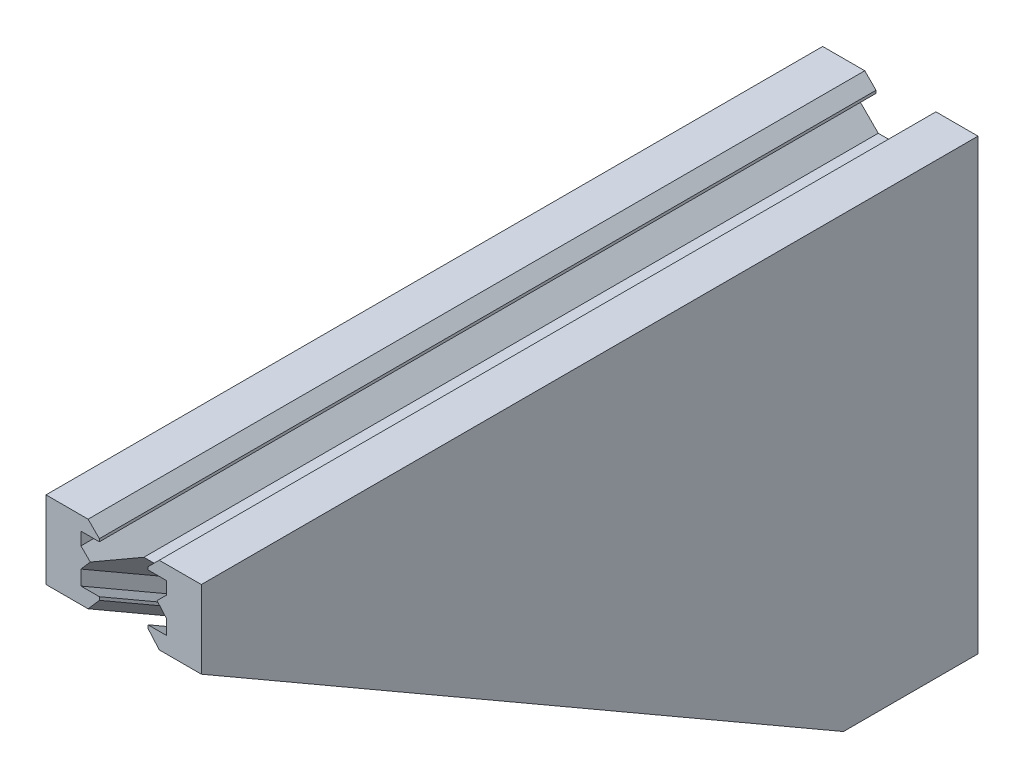
ISO-10303-21;
HEADER;
FILE_DESCRIPTION(('STEP AP214'),'2;1');
FILE_NAME('part.step','',(''),(''),'','','');
FILE_SCHEMA(('AUTOMOTIVE_DESIGN { 1 0 10303 214 1 1 1 1 }'));
ENDSEC;
DATA;
#1=APPLICATION_CONTEXT('core data for automotive mechanical design processes');
#2=APPLICATION_PROTOCOL_DEFINITION('international standard','automotive_design',2000,#1);
#3=PRODUCT_CONTEXT('',#1,'mechanical');
#4=PRODUCT('Part','Part','',(#3));
#5=PRODUCT_RELATED_PRODUCT_CATEGORY('part','',(#4));
#6=PRODUCT_DEFINITION_FORMATION('','',#4);
#7=PRODUCT_DEFINITION_CONTEXT('part definition',#1,'design');
#8=PRODUCT_DEFINITION('design','',#6,#7);
#9=PRODUCT_DEFINITION_SHAPE('','',#8);
#10=(LENGTH_UNIT() NAMED_UNIT(*) SI_UNIT(.MILLI.,.METRE.));
#11=(NAMED_UNIT(*) PLANE_ANGLE_UNIT() SI_UNIT($,.RADIAN.));
#12=(NAMED_UNIT(*) SI_UNIT($,.STERADIAN.) SOLID_ANGLE_UNIT());
#13=UNCERTAINTY_MEASURE_WITH_UNIT(LENGTH_MEASURE(1.E-05),#10,'distance_accuracy_value','');
#14=(GEOMETRIC_REPRESENTATION_CONTEXT(3) GLOBAL_UNCERTAINTY_ASSIGNED_CONTEXT((#13)) GLOBAL_UNIT_ASSIGNED_CONTEXT((#10,
#11,#12)) REPRESENTATION_CONTEXT('',''));
#15=CARTESIAN_POINT('',(0.,0.,0.));
#16=DIRECTION('',(0.,0.,1.));
#17=DIRECTION('',(1.,0.,0.));
#18=AXIS2_PLACEMENT_3D('',#15,#16,#17);
#19=CARTESIAN_POINT('',(10.,-10.,100.));
#20=DIRECTION('',(0.,0.,-1.));
#21=DIRECTION('',(-1.,0.,0.));
#22=AXIS2_PLACEMENT_3D('',#19,#20,#21);
#23=PLANE('',#22);
#24=DIRECTION('',(-0.654653670707976,0.755928946018456,0.));
#25=VECTOR('',#24,1.);
#26=CARTESIAN_POINT('',(6.90285714285712,-12.6822043934353,100.));
#27=LINE('',#26,#25);
#28=CARTESIAN_POINT('',(4.58,-10.0000000000001,100.));
#29=VERTEX_POINT('',#28);
#30=CARTESIAN_POINT('',(3.13,-8.32568421935014,100.));
#31=VERTEX_POINT('',#30);
#32=EDGE_CURVE('E309',#29,#31,#27,.T.);
#33=ORIENTED_EDGE('',*,*,#32,.F.);
#34=DIRECTION('',(-1.,0.,0.));
#35=VECTOR('',#34,1.);
#36=CARTESIAN_POINT('',(10.,-10.,100.));
#37=LINE('',#36,#35);
#38=CARTESIAN_POINT('',(10.,-10.,100.));
#39=VERTEX_POINT('',#38);
#40=EDGE_CURVE('E249',#39,#29,#37,.T.);
#41=ORIENTED_EDGE('',*,*,#40,.F.);
#42=DIRECTION('',(0.,-1.,0.));
#43=VECTOR('',#42,1.);
#44=CARTESIAN_POINT('',(10.,-10.,100.));
#45=LINE('',#44,#43);
#46=CARTESIAN_POINT('',(10.,0.,100.));
#47=VERTEX_POINT('',#46);
#48=EDGE_CURVE('E403',#47,#39,#45,.T.);
#49=ORIENTED_EDGE('',*,*,#48,.F.);
#50=DIRECTION('',(-1.,0.,0.));
#51=VECTOR('',#50,1.);
#52=CARTESIAN_POINT('',(10.,0.,100.));
#53=LINE('',#52,#51);
#54=CARTESIAN_POINT('',(4.58,0.,100.));
#55=VERTEX_POINT('',#54);
#56=EDGE_CURVE('E419',#47,#55,#53,.T.);
#57=ORIENTED_EDGE('',*,*,#56,.T.);
#58=DIRECTION('',(0.707106781186547,0.707106781186548,0.));
#59=VECTOR('',#58,1.);
#60=CARTESIAN_POINT('',(4.58,0.,100.));
#61=LINE('',#60,#59);
#62=CARTESIAN_POINT('',(3.13,-1.45000000000001,100.));
#63=VERTEX_POINT('',#62);
#64=EDGE_CURVE('E317',#63,#55,#61,.T.);
#65=ORIENTED_EDGE('',*,*,#64,.F.);
#66=DIRECTION('',(0.,1.,0.));
#67=VECTOR('',#66,1.);
#68=CARTESIAN_POINT('',(3.13,-1.45000000000001,100.));
#69=LINE('',#68,#67);
#70=CARTESIAN_POINT('',(3.13,-1.8,100.));
#71=VERTEX_POINT('',#70);
#72=EDGE_CURVE('E366',#71,#63,#69,.T.);
#73=ORIENTED_EDGE('',*,*,#72,.F.);
#74=DIRECTION('',(-1.,0.,0.));
#75=VECTOR('',#74,1.);
#76=CARTESIAN_POINT('',(3.13,-1.8,100.));
#77=LINE('',#76,#75);
#78=CARTESIAN_POINT('',(5.5,-1.8,100.));
#79=VERTEX_POINT('',#78);
#80=EDGE_CURVE('E363',#79,#71,#77,.T.);
#81=ORIENTED_EDGE('',*,*,#80,.F.);
#82=DIRECTION('',(0.,1.,0.));
#83=VECTOR('',#82,1.);
#84=CARTESIAN_POINT('',(5.5,-1.8,100.));
#85=LINE('',#84,#83);
#86=CARTESIAN_POINT('',(5.5,-3.44,100.));
#87=VERTEX_POINT('',#86);
#88=EDGE_CURVE('E360',#87,#79,#85,.T.);
#89=ORIENTED_EDGE('',*,*,#88,.F.);
#90=DIRECTION('',(0.707106781186546,0.707106781186549,0.));
#91=VECTOR('',#90,1.);
#92=CARTESIAN_POINT('',(5.5,-3.44,100.));
#93=LINE('',#92,#91);
#94=CARTESIAN_POINT('',(4.29898384862244,-4.64101615137756,100.));
#95=VERTEX_POINT('',#94);
#96=EDGE_CURVE('E300',#95,#87,#93,.T.);
#97=ORIENTED_EDGE('',*,*,#96,.F.);
#98=DIRECTION('',(-0.654653670707975,0.755928946018457,0.));
#99=VECTOR('',#98,1.);
#100=CARTESIAN_POINT('',(9.3942857142857,-10.5245639588638,100.));
#101=LINE('',#100,#99);
#102=CARTESIAN_POINT('',(5.5,-6.02783014797542,100.));
#103=VERTEX_POINT('',#102);
#104=EDGE_CURVE('E298',#103,#95,#101,.T.);
#105=ORIENTED_EDGE('',*,*,#104,.F.);
#106=DIRECTION('',(0.,1.,0.));
#107=VECTOR('',#106,1.);
#108=CARTESIAN_POINT('',(5.5,-10.,100.));
#109=LINE('',#108,#107);
#110=CARTESIAN_POINT('',(5.5,-7.9215390309174,100.));
#111=VERTEX_POINT('',#110);
#112=EDGE_CURVE('E275',#111,#103,#109,.T.);
#113=ORIENTED_EDGE('',*,*,#112,.F.);
#114=DIRECTION('',(1.,0.,0.));
#115=VECTOR('',#114,1.);
#116=CARTESIAN_POINT('',(10.,-7.9215390309174,100.));
#117=LINE('',#116,#115);
#118=CARTESIAN_POINT('',(3.13,-7.9215390309174,100.));
#119=VERTEX_POINT('',#118);
#120=EDGE_CURVE('E44',#119,#111,#117,.T.);
#121=ORIENTED_EDGE('',*,*,#120,.F.);
#122=DIRECTION('',(0.,1.,0.));
#123=VECTOR('',#122,1.);
#124=CARTESIAN_POINT('',(3.13,-10.,100.));
#125=LINE('',#124,#123);
#126=EDGE_CURVE('E11',#31,#119,#125,.T.);
#127=ORIENTED_EDGE('',*,*,#126,.F.);
#128=EDGE_LOOP('',(#33,#41,#49,#57,#65,#73,#81,#89,#97,#105,#113,#121,#127));
#129=FACE_BOUND('',#128,.T.);
#130=ADVANCED_FACE('F35',(#129),#23,.F.);
#131=DIRECTION('',(-0.654653670707974,-0.755928946018457,0.));
#132=VECTOR('',#131,1.);
#133=CARTESIAN_POINT('',(-0.822857142857193,-0.627130772755913,100.));
#134=LINE('',#133,#132);
#135=CARTESIAN_POINT('',(-4.29898384862244,-4.64101615137756,100.));
#136=VERTEX_POINT('',#135);
#137=CARTESIAN_POINT('',(-5.49999999999999,-6.02783014797542,100.));
#138=VERTEX_POINT('',#137);
#139=EDGE_CURVE('E304',#136,#138,#134,.T.);
#140=ORIENTED_EDGE('',*,*,#139,.F.);
#141=DIRECTION('',(0.707106781186546,-0.707106781186549,0.));
#142=VECTOR('',#141,1.);
#143=CARTESIAN_POINT('',(-5.5,-3.44,100.));
#144=LINE('',#143,#142);
#145=CARTESIAN_POINT('',(-5.5,-3.44,100.));
#146=VERTEX_POINT('',#145);
#147=EDGE_CURVE('E356',#146,#136,#144,.T.);
#148=ORIENTED_EDGE('',*,*,#147,.F.);
#149=DIRECTION('',(0.,-1.,0.));
#150=VECTOR('',#149,1.);
#151=CARTESIAN_POINT('',(-5.5,-1.8,100.));
#152=LINE('',#151,#150);
#153=CARTESIAN_POINT('',(-5.5,-1.8,100.));
#154=VERTEX_POINT('',#153);
#155=EDGE_CURVE('E353',#154,#146,#152,.T.);
#156=ORIENTED_EDGE('',*,*,#155,.F.);
#157=DIRECTION('',(-1.,0.,0.));
#158=VECTOR('',#157,1.);
#159=CARTESIAN_POINT('',(-3.13,-1.8,100.));
#160=LINE('',#159,#158);
#161=CARTESIAN_POINT('',(-3.13,-1.8,100.));
#162=VERTEX_POINT('',#161);
#163=EDGE_CURVE('E350',#162,#154,#160,.T.);
#164=ORIENTED_EDGE('',*,*,#163,.F.);
#165=DIRECTION('',(0.,-1.,0.));
#166=VECTOR('',#165,1.);
#167=CARTESIAN_POINT('',(-3.13,-1.45000000000001,100.));
#168=LINE('',#167,#166);
#169=CARTESIAN_POINT('',(-3.13,-1.45000000000001,100.));
#170=VERTEX_POINT('',#169);
#171=EDGE_CURVE('E307',#170,#162,#168,.T.);
#172=ORIENTED_EDGE('',*,*,#171,.F.);
#173=DIRECTION('',(0.707106781186546,-0.707106781186548,0.));
#174=VECTOR('',#173,1.);
#175=CARTESIAN_POINT('',(-4.58,0.,100.));
#176=LINE('',#175,#174);
#177=CARTESIAN_POINT('',(-4.57999999999997,0.,100.));
#178=VERTEX_POINT('',#177);
#179=EDGE_CURVE('E303',#178,#170,#176,.T.);
#180=ORIENTED_EDGE('',*,*,#179,.F.);
#181=CARTESIAN_POINT('',(-10.,0.,100.));
#182=VERTEX_POINT('',#181);
#183=EDGE_CURVE('E418',#178,#182,#53,.T.);
#184=ORIENTED_EDGE('',*,*,#183,.T.);
#185=DIRECTION('',(0.,-1.,0.));
#186=VECTOR('',#185,1.);
#187=CARTESIAN_POINT('',(-10.,-10.,100.));
#188=LINE('',#187,#186);
#189=CARTESIAN_POINT('',(-10.,-10.,100.));
#190=VERTEX_POINT('',#189);
#191=EDGE_CURVE('E412',#182,#190,#188,.T.);
#192=ORIENTED_EDGE('',*,*,#191,.T.);
#193=CARTESIAN_POINT('',(-4.58,-10.0000000000001,100.));
#194=VERTEX_POINT('',#193);
#195=EDGE_CURVE('E407',#194,#190,#37,.T.);
#196=ORIENTED_EDGE('',*,*,#195,.F.);
#197=DIRECTION('',(-0.654653670707976,-0.755928946018456,0.));
#198=VECTOR('',#197,1.);
#199=CARTESIAN_POINT('',(1.66857142857141,-2.78477120732741,100.));
#200=LINE('',#199,#198);
#201=CARTESIAN_POINT('',(-3.13,-8.32568421935014,100.));
#202=VERTEX_POINT('',#201);
#203=EDGE_CURVE('E250',#202,#194,#200,.T.);
#204=ORIENTED_EDGE('',*,*,#203,.F.);
#205=DIRECTION('',(0.,-1.,0.));
#206=VECTOR('',#205,1.);
#207=CARTESIAN_POINT('',(-3.13,-10.,100.));
#208=LINE('',#207,#206);
#209=CARTESIAN_POINT('',(-3.13,-7.9215390309174,100.));
#210=VERTEX_POINT('',#209);
#211=EDGE_CURVE('E269',#210,#202,#208,.T.);
#212=ORIENTED_EDGE('',*,*,#211,.F.);
#213=DIRECTION('',(1.,0.,0.));
#214=VECTOR('',#213,1.);
#215=CARTESIAN_POINT('',(10.,-7.9215390309174,100.));
#216=LINE('',#215,#214);
#217=CARTESIAN_POINT('',(-5.49999999999999,-7.9215390309174,100.));
#218=VERTEX_POINT('',#217);
#219=EDGE_CURVE('E271',#218,#210,#216,.T.);
#220=ORIENTED_EDGE('',*,*,#219,.F.);
#221=DIRECTION('',(0.,-1.,0.));
#222=VECTOR('',#221,1.);
#223=CARTESIAN_POINT('',(-5.49999999999999,-10.,100.));
#224=LINE('',#223,#222);
#225=EDGE_CURVE('E273',#138,#218,#224,.T.);
#226=ORIENTED_EDGE('',*,*,#225,.F.);
#227=EDGE_LOOP('',(#140,#148,#156,#164,#172,#180,#184,#192,#196,#204,#212,#220,#226));
#228=FACE_BOUND('',#227,.T.);
#229=ADVANCED_FACE('F501',(#228),#23,.F.);
#230=CARTESIAN_POINT('',(10.,-67.7350269189632,0.));
#231=DIRECTION('',(0.,0.866025403784436,-0.500000000000004));
#232=DIRECTION('',(0.,0.500000000000004,0.866025403784437));
#233=AXIS2_PLACEMENT_3D('',#230,#231,#232);
#234=PLANE('',#233);
#235=DIRECTION('',(0.,-0.500000000000004,-0.866025403784436));
#236=VECTOR('',#235,1.);
#237=CARTESIAN_POINT('',(4.58,-7.50000000000001,104.330127018922));
#238=LINE('',#237,#236);
#239=CARTESIAN_POINT('',(4.58,-57.7350269189632,17.3205080756886));
#240=VERTEX_POINT('',#239);
#241=EDGE_CURVE('E231',#29,#240,#238,.T.);
#242=ORIENTED_EDGE('',*,*,#241,.T.);
#243=DIRECTION('',(1.,0.,0.));
#244=VECTOR('',#243,1.);
#245=CARTESIAN_POINT('',(10.,-57.7350269189632,17.3205080756886));
#246=LINE('',#245,#244);
#247=CARTESIAN_POINT('',(10.,-57.7350269189632,17.3205080756886));
#248=VERTEX_POINT('',#247);
#249=EDGE_CURVE('E59',#240,#248,#246,.T.);
#250=ORIENTED_EDGE('',*,*,#249,.T.);
#251=DIRECTION('',(0.,-0.500000000000004,-0.866025403784436));
#252=VECTOR('',#251,1.);
#253=CARTESIAN_POINT('',(10.,-67.7350269189632,0.));
#254=LINE('',#253,#252);
#255=EDGE_CURVE('E405',#39,#248,#254,.T.);
#256=ORIENTED_EDGE('',*,*,#255,.F.);
#257=ORIENTED_EDGE('',*,*,#40,.T.);
#258=EDGE_LOOP('',(#242,#250,#256,#257));
#259=FACE_BOUND('',#258,.T.);
#260=ADVANCED_FACE('F247',(#259),#234,.F.);
#261=DIRECTION('',(0.,-0.500000000000004,-0.866025403784436));
#262=VECTOR('',#261,1.);
#263=CARTESIAN_POINT('',(-4.58,-7.50000000000001,104.330127018922));
#264=LINE('',#263,#262);
#265=CARTESIAN_POINT('',(-4.58,-57.7350269189632,17.3205080756886));
#266=VERTEX_POINT('',#265);
#267=EDGE_CURVE('E564',#194,#266,#264,.T.);
#268=ORIENTED_EDGE('',*,*,#267,.F.);
#269=ORIENTED_EDGE('',*,*,#195,.T.);
#270=DIRECTION('',(0.,-0.500000000000004,-0.866025403784436));
#271=VECTOR('',#270,1.);
#272=CARTESIAN_POINT('',(-10.,-67.7350269189632,0.));
#273=LINE('',#272,#271);
#274=CARTESIAN_POINT('',(-10.,-57.7350269189632,17.3205080756886));
#275=VERTEX_POINT('',#274);
#276=EDGE_CURVE('E401',#190,#275,#273,.T.);
#277=ORIENTED_EDGE('',*,*,#276,.T.);
#278=EDGE_CURVE('E255',#275,#266,#246,.T.);
#279=ORIENTED_EDGE('',*,*,#278,.T.);
#280=EDGE_LOOP('',(#268,#269,#277,#279));
#281=FACE_BOUND('',#280,.T.);
#282=ADVANCED_FACE('F555',(#281),#234,.F.);
#283=CARTESIAN_POINT('',(5.5,-3.44,0.));
#284=DIRECTION('',(0.707106781186549,-0.707106781186546,0.));
#285=DIRECTION('',(0.707106781186546,0.707106781186549,0.));
#286=AXIS2_PLACEMENT_3D('',#283,#284,#285);
#287=PLANE('',#286);
#288=DIRECTION('',(-0.250562807085733,-0.250562807085734,-0.935113126531029));
#289=VECTOR('',#288,1.);
#290=CARTESIAN_POINT('',(-18.9806694238402,-27.9206694238403,13.1191512045826));
#291=LINE('',#290,#289);
#292=CARTESIAN_POINT('',(2.84000000000002,-6.1,94.5549981495188));
#293=VERTEX_POINT('',#292);
#294=EDGE_CURVE('E267',#95,#293,#291,.T.);
#295=ORIENTED_EDGE('',*,*,#294,.F.);
#296=ORIENTED_EDGE('',*,*,#96,.T.);
#297=DIRECTION('',(0.,0.,1.));
#298=VECTOR('',#297,1.);
#299=CARTESIAN_POINT('',(5.5,-3.44,0.));
#300=LINE('',#299,#298);
#301=CARTESIAN_POINT('',(5.5,-3.44,0.));
#302=VERTEX_POINT('',#301);
#303=EDGE_CURVE('E380',#302,#87,#300,.T.);
#304=ORIENTED_EDGE('',*,*,#303,.F.);
#305=DIRECTION('',(0.707106781186546,0.707106781186549,0.));
#306=VECTOR('',#305,1.);
#307=CARTESIAN_POINT('',(5.5,-3.44,0.));
#308=LINE('',#307,#306);
#309=CARTESIAN_POINT('',(2.84000000000001,-6.1,0.));
#310=VERTEX_POINT('',#309);
#311=EDGE_CURVE('E332',#310,#302,#308,.T.);
#312=ORIENTED_EDGE('',*,*,#311,.F.);
#313=DIRECTION('',(0.,0.,1.));
#314=VECTOR('',#313,1.);
#315=CARTESIAN_POINT('',(2.84000000000001,-6.1,0.));
#316=LINE('',#315,#314);
#317=EDGE_CURVE('E383',#310,#293,#316,.T.);
#318=ORIENTED_EDGE('',*,*,#317,.T.);
#319=EDGE_LOOP('',(#295,#296,#304,#312,#318));
#320=FACE_BOUND('',#319,.T.);
#321=ADVANCED_FACE('F469',(#320),#287,.F.);
#322=CARTESIAN_POINT('',(-2.84000000000001,-6.1,0.));
#323=DIRECTION('',(0.,-1.,0.));
#324=DIRECTION('',(1.,0.,0.));
#325=AXIS2_PLACEMENT_3D('',#322,#323,#324);
#326=PLANE('',#325);
#327=DIRECTION('',(-1.,0.,0.));
#328=VECTOR('',#327,1.);
#329=CARTESIAN_POINT('',(-2.84000000000003,-6.1,94.5549981495188));
#330=LINE('',#329,#328);
#331=CARTESIAN_POINT('',(-2.83999999999999,-6.10000000000006,94.5549981495186));
#332=VERTEX_POINT('',#331);
#333=EDGE_CURVE('E265',#293,#332,#330,.T.);
#334=ORIENTED_EDGE('',*,*,#333,.F.);
#335=ORIENTED_EDGE('',*,*,#317,.F.);
#336=DIRECTION('',(1.,0.,0.));
#337=VECTOR('',#336,1.);
#338=CARTESIAN_POINT('',(-2.84000000000001,-6.1,0.));
#339=LINE('',#338,#337);
#340=CARTESIAN_POINT('',(-2.84000000000001,-6.1,0.));
#341=VERTEX_POINT('',#340);
#342=EDGE_CURVE('E329',#341,#310,#339,.T.);
#343=ORIENTED_EDGE('',*,*,#342,.F.);
#344=DIRECTION('',(0.,0.,1.));
#345=VECTOR('',#344,1.);
#346=CARTESIAN_POINT('',(-2.84000000000001,-6.1,0.));
#347=LINE('',#346,#345);
#348=EDGE_CURVE('E386',#341,#332,#347,.T.);
#349=ORIENTED_EDGE('',*,*,#348,.T.);
#350=EDGE_LOOP('',(#334,#335,#343,#349));
#351=FACE_BOUND('',#350,.T.);
#352=ADVANCED_FACE('F465',(#351),#326,.F.);
#353=CARTESIAN_POINT('',(-5.5,-3.44,0.));
#354=DIRECTION('',(-0.707106781186549,-0.707106781186546,0.));
#355=DIRECTION('',(0.707106781186546,-0.707106781186549,0.));
#356=AXIS2_PLACEMENT_3D('',#353,#354,#355);
#357=PLANE('',#356);
#358=DIRECTION('',(-0.250562807085732,0.250562807085733,0.935113126531029));
#359=VECTOR('',#358,1.);
#360=CARTESIAN_POINT('',(18.9806694238402,-27.9206694238403,13.1191512045826));
#361=LINE('',#360,#359);
#362=EDGE_CURVE('E263',#332,#136,#361,.T.);
#363=ORIENTED_EDGE('',*,*,#362,.F.);
#364=ORIENTED_EDGE('',*,*,#348,.F.);
#365=DIRECTION('',(0.707106781186546,-0.707106781186549,0.));
#366=VECTOR('',#365,1.);
#367=CARTESIAN_POINT('',(-5.5,-3.44,0.));
#368=LINE('',#367,#366);
#369=CARTESIAN_POINT('',(-5.5,-3.44,0.));
#370=VERTEX_POINT('',#369);
#371=EDGE_CURVE('E326',#370,#341,#368,.T.);
#372=ORIENTED_EDGE('',*,*,#371,.F.);
#373=DIRECTION('',(0.,0.,1.));
#374=VECTOR('',#373,1.);
#375=CARTESIAN_POINT('',(-5.5,-3.44,0.));
#376=LINE('',#375,#374);
#377=EDGE_CURVE('E389',#370,#146,#376,.T.);
#378=ORIENTED_EDGE('',*,*,#377,.T.);
#379=ORIENTED_EDGE('',*,*,#147,.T.);
#380=EDGE_LOOP('',(#363,#364,#372,#378,#379));
#381=FACE_BOUND('',#380,.T.);
#382=ADVANCED_FACE('F461',(#381),#357,.F.);
#383=CARTESIAN_POINT('',(10.,0.,100.));
#384=DIRECTION('',(0.,-1.,0.));
#385=DIRECTION('',(0.,0.,-1.));
#386=AXIS2_PLACEMENT_3D('',#383,#384,#385);
#387=PLANE('',#386);
#388=DIRECTION('',(-1.,0.,0.));
#389=VECTOR('',#388,1.);
#390=CARTESIAN_POINT('',(10.,0.,0.));
#391=LINE('',#390,#389);
#392=CARTESIAN_POINT('',(10.,0.,0.));
#393=VERTEX_POINT('',#392);
#394=CARTESIAN_POINT('',(4.58,0.,0.));
#395=VERTEX_POINT('',#394);
#396=EDGE_CURVE('E423',#393,#395,#391,.T.);
#397=ORIENTED_EDGE('',*,*,#396,.T.);
#398=DIRECTION('',(0.,0.,1.));
#399=VECTOR('',#398,1.);
#400=CARTESIAN_POINT('',(4.58,0.,0.));
#401=LINE('',#400,#399);
#402=EDGE_CURVE('E370',#395,#55,#401,.T.);
#403=ORIENTED_EDGE('',*,*,#402,.T.);
#404=ORIENTED_EDGE('',*,*,#56,.F.);
#405=DIRECTION('',(0.,0.,1.));
#406=VECTOR('',#405,1.);
#407=CARTESIAN_POINT('',(10.,0.,100.));
#408=LINE('',#407,#406);
#409=EDGE_CURVE('E400',#393,#47,#408,.T.);
#410=ORIENTED_EDGE('',*,*,#409,.F.);
#411=EDGE_LOOP('',(#397,#403,#404,#410));
#412=FACE_BOUND('',#411,.T.);
#413=ADVANCED_FACE('F486',(#412),#387,.F.);
#414=CARTESIAN_POINT('',(10.,0.,0.));
#415=DIRECTION('',(0.,0.,1.));
#416=DIRECTION('',(0.,-1.,0.));
#417=AXIS2_PLACEMENT_3D('',#414,#415,#416);
#418=PLANE('',#417);
#419=DIRECTION('',(0.,1.,0.));
#420=VECTOR('',#419,1.);
#421=CARTESIAN_POINT('',(10.,0.,0.));
#422=LINE('',#421,#420);
#423=CARTESIAN_POINT('',(10.,-57.7350269189632,0.));
#424=VERTEX_POINT('',#423);
#425=EDGE_CURVE('E398',#424,#393,#422,.T.);
#426=ORIENTED_EDGE('',*,*,#425,.F.);
#427=DIRECTION('',(-1.,0.,0.));
#428=VECTOR('',#427,1.);
#429=CARTESIAN_POINT('',(10.,-57.7350269189632,0.));
#430=LINE('',#429,#428);
#431=CARTESIAN_POINT('',(-10.,-57.7350269189632,0.));
#432=VERTEX_POINT('',#431);
#433=EDGE_CURVE('E258',#424,#432,#430,.T.);
#434=ORIENTED_EDGE('',*,*,#433,.T.);
#435=DIRECTION('',(0.,1.,0.));
#436=VECTOR('',#435,1.);
#437=CARTESIAN_POINT('',(-10.,0.,0.));
#438=LINE('',#437,#436);
#439=CARTESIAN_POINT('',(-10.,0.,0.));
#440=VERTEX_POINT('',#439);
#441=EDGE_CURVE('E373',#432,#440,#438,.T.);
#442=ORIENTED_EDGE('',*,*,#441,.T.);
#443=CARTESIAN_POINT('',(-4.58,0.,0.));
#444=VERTEX_POINT('',#443);
#445=EDGE_CURVE('E422',#444,#440,#391,.T.);
#446=ORIENTED_EDGE('',*,*,#445,.F.);
#447=DIRECTION('',(0.707106781186546,-0.707106781186548,0.));
#448=VECTOR('',#447,1.);
#449=CARTESIAN_POINT('',(-4.58,0.,0.));
#450=LINE('',#449,#448);
#451=CARTESIAN_POINT('',(-3.13,-1.45000000000001,0.));
#452=VERTEX_POINT('',#451);
#453=EDGE_CURVE('E313',#444,#452,#450,.T.);
#454=ORIENTED_EDGE('',*,*,#453,.T.);
#455=DIRECTION('',(0.,-1.,0.));
#456=VECTOR('',#455,1.);
#457=CARTESIAN_POINT('',(-3.13,-1.45000000000001,0.));
#458=LINE('',#457,#456);
#459=CARTESIAN_POINT('',(-3.13,-1.8,0.));
#460=VERTEX_POINT('',#459);
#461=EDGE_CURVE('E316',#452,#460,#458,.T.);
#462=ORIENTED_EDGE('',*,*,#461,.T.);
#463=DIRECTION('',(-1.,0.,0.));
#464=VECTOR('',#463,1.);
#465=CARTESIAN_POINT('',(-3.13,-1.8,0.));
#466=LINE('',#465,#464);
#467=CARTESIAN_POINT('',(-5.5,-1.8,0.));
#468=VERTEX_POINT('',#467);
#469=EDGE_CURVE('E320',#460,#468,#466,.T.);
#470=ORIENTED_EDGE('',*,*,#469,.T.);
#471=DIRECTION('',(0.,-1.,0.));
#472=VECTOR('',#471,1.);
#473=CARTESIAN_POINT('',(-5.5,-1.8,0.));
#474=LINE('',#473,#472);
#475=EDGE_CURVE('E323',#468,#370,#474,.T.);
#476=ORIENTED_EDGE('',*,*,#475,.T.);
#477=ORIENTED_EDGE('',*,*,#371,.T.);
#478=ORIENTED_EDGE('',*,*,#342,.T.);
#479=ORIENTED_EDGE('',*,*,#311,.T.);
#480=DIRECTION('',(0.,1.,0.));
#481=VECTOR('',#480,1.);
#482=CARTESIAN_POINT('',(5.5,-1.8,0.));
#483=LINE('',#482,#481);
#484=CARTESIAN_POINT('',(5.5,-1.8,0.));
#485=VERTEX_POINT('',#484);
#486=EDGE_CURVE('E335',#302,#485,#483,.T.);
#487=ORIENTED_EDGE('',*,*,#486,.T.);
#488=DIRECTION('',(-1.,0.,0.));
#489=VECTOR('',#488,1.);
#490=CARTESIAN_POINT('',(3.13,-1.8,0.));
#491=LINE('',#490,#489);
#492=CARTESIAN_POINT('',(3.13,-1.8,0.));
#493=VERTEX_POINT('',#492);
#494=EDGE_CURVE('E338',#485,#493,#491,.T.);
#495=ORIENTED_EDGE('',*,*,#494,.T.);
#496=DIRECTION('',(0.,1.,0.));
#497=VECTOR('',#496,1.);
#498=CARTESIAN_POINT('',(3.13,-1.45000000000001,0.));
#499=LINE('',#498,#497);
#500=CARTESIAN_POINT('',(3.13,-1.45000000000001,0.));
#501=VERTEX_POINT('',#500);
#502=EDGE_CURVE('E341',#493,#501,#499,.T.);
#503=ORIENTED_EDGE('',*,*,#502,.T.);
#504=DIRECTION('',(0.707106781186547,0.707106781186548,0.));
#505=VECTOR('',#504,1.);
#506=CARTESIAN_POINT('',(4.58,0.,0.));
#507=LINE('',#506,#505);
#508=EDGE_CURVE('E344',#501,#395,#507,.T.);
#509=ORIENTED_EDGE('',*,*,#508,.T.);
#510=ORIENTED_EDGE('',*,*,#396,.F.);
#511=EDGE_LOOP('',(#426,#434,#442,#446,#454,#462,#470,#476,#477,#478,#479,#487,#495,#503,#509,#510));
#512=FACE_BOUND('',#511,.T.);
#513=ADVANCED_FACE('F429',(#512),#418,.F.);
#514=ORIENTED_EDGE('',*,*,#183,.F.);
#515=DIRECTION('',(0.,0.,1.));
#516=VECTOR('',#515,1.);
#517=CARTESIAN_POINT('',(-4.58,0.,0.));
#518=LINE('',#517,#516);
#519=EDGE_CURVE('E346',#444,#178,#518,.T.);
#520=ORIENTED_EDGE('',*,*,#519,.F.);
#521=ORIENTED_EDGE('',*,*,#445,.T.);
#522=DIRECTION('',(0.,0.,1.));
#523=VECTOR('',#522,1.);
#524=CARTESIAN_POINT('',(-10.,0.,100.));
#525=LINE('',#524,#523);
#526=EDGE_CURVE('E409',#440,#182,#525,.T.);
#527=ORIENTED_EDGE('',*,*,#526,.T.);
#528=EDGE_LOOP('',(#514,#520,#521,#527));
#529=FACE_BOUND('',#528,.T.);
#530=ADVANCED_FACE('F440',(#529),#387,.F.);
#531=CARTESIAN_POINT('',(10.,0.,0.));
#532=DIRECTION('',(1.,0.,0.));
#533=DIRECTION('',(0.,0.,-1.));
#534=AXIS2_PLACEMENT_3D('',#531,#532,#533);
#535=PLANE('',#534);
#536=ORIENTED_EDGE('',*,*,#255,.T.);
#537=DIRECTION('',(0.,0.,1.));
#538=VECTOR('',#537,1.);
#539=CARTESIAN_POINT('',(10.,-57.7350269189632,0.));
#540=LINE('',#539,#538);
#541=EDGE_CURVE('E254',#248,#424,#540,.F.);
#542=ORIENTED_EDGE('',*,*,#541,.T.);
#543=ORIENTED_EDGE('',*,*,#425,.T.);
#544=ORIENTED_EDGE('',*,*,#409,.T.);
#545=ORIENTED_EDGE('',*,*,#48,.T.);
#546=EDGE_LOOP('',(#536,#542,#543,#544,#545));
#547=FACE_BOUND('',#546,.T.);
#548=ADVANCED_FACE('F490',(#547),#535,.T.);
#549=CARTESIAN_POINT('',(-10.,0.,0.));
#550=DIRECTION('',(1.,0.,0.));
#551=DIRECTION('',(0.,0.,-1.));
#552=AXIS2_PLACEMENT_3D('',#549,#550,#551);
#553=PLANE('',#552);
#554=ORIENTED_EDGE('',*,*,#441,.F.);
#555=DIRECTION('',(0.,0.,-1.));
#556=VECTOR('',#555,1.);
#557=CARTESIAN_POINT('',(-10.,-57.7350269189632,0.));
#558=LINE('',#557,#556);
#559=EDGE_CURVE('E256',#432,#275,#558,.F.);
#560=ORIENTED_EDGE('',*,*,#559,.T.);
#561=ORIENTED_EDGE('',*,*,#276,.F.);
#562=ORIENTED_EDGE('',*,*,#191,.F.);
#563=ORIENTED_EDGE('',*,*,#526,.F.);
#564=EDGE_LOOP('',(#554,#560,#561,#562,#563));
#565=FACE_BOUND('',#564,.T.);
#566=ADVANCED_FACE('F435',(#565),#553,.F.);
#567=CARTESIAN_POINT('',(4.58,0.,0.));
#568=DIRECTION('',(0.707106781186548,-0.707106781186547,0.));
#569=DIRECTION('',(0.707106781186547,0.707106781186548,0.));
#570=AXIS2_PLACEMENT_3D('',#567,#568,#569);
#571=PLANE('',#570);
#572=ORIENTED_EDGE('',*,*,#64,.T.);
#573=ORIENTED_EDGE('',*,*,#402,.F.);
#574=ORIENTED_EDGE('',*,*,#508,.F.);
#575=DIRECTION('',(0.,0.,1.));
#576=VECTOR('',#575,1.);
#577=CARTESIAN_POINT('',(3.13,-1.45000000000001,0.));
#578=LINE('',#577,#576);
#579=EDGE_CURVE('E374',#501,#63,#578,.T.);
#580=ORIENTED_EDGE('',*,*,#579,.T.);
#581=EDGE_LOOP('',(#572,#573,#574,#580));
#582=FACE_BOUND('',#581,.T.);
#583=ADVANCED_FACE('F483',(#582),#571,.F.);
#584=CARTESIAN_POINT('',(3.13,-1.45000000000001,0.));
#585=DIRECTION('',(1.,0.,0.));
#586=DIRECTION('',(0.,1.,0.));
#587=AXIS2_PLACEMENT_3D('',#584,#585,#586);
#588=PLANE('',#587);
#589=ORIENTED_EDGE('',*,*,#72,.T.);
#590=ORIENTED_EDGE('',*,*,#579,.F.);
#591=ORIENTED_EDGE('',*,*,#502,.F.);
#592=DIRECTION('',(0.,0.,1.));
#593=VECTOR('',#592,1.);
#594=CARTESIAN_POINT('',(3.13,-1.8,0.));
#595=LINE('',#594,#593);
#596=EDGE_CURVE('E376',#493,#71,#595,.T.);
#597=ORIENTED_EDGE('',*,*,#596,.T.);
#598=EDGE_LOOP('',(#589,#590,#591,#597));
#599=FACE_BOUND('',#598,.T.);
#600=ADVANCED_FACE('F479',(#599),#588,.F.);
#601=CARTESIAN_POINT('',(3.13,-1.8,0.));
#602=DIRECTION('',(0.,1.,0.));
#603=DIRECTION('',(-1.,0.,0.));
#604=AXIS2_PLACEMENT_3D('',#601,#602,#603);
#605=PLANE('',#604);
#606=ORIENTED_EDGE('',*,*,#80,.T.);
#607=ORIENTED_EDGE('',*,*,#596,.F.);
#608=ORIENTED_EDGE('',*,*,#494,.F.);
#609=DIRECTION('',(0.,0.,1.));
#610=VECTOR('',#609,1.);
#611=CARTESIAN_POINT('',(5.5,-1.8,0.));
#612=LINE('',#611,#610);
#613=EDGE_CURVE('E378',#485,#79,#612,.T.);
#614=ORIENTED_EDGE('',*,*,#613,.T.);
#615=EDGE_LOOP('',(#606,#607,#608,#614));
#616=FACE_BOUND('',#615,.T.);
#617=ADVANCED_FACE('F475',(#616),#605,.F.);
#618=CARTESIAN_POINT('',(5.5,-1.8,0.));
#619=DIRECTION('',(1.,0.,0.));
#620=DIRECTION('',(0.,0.,-1.));
#621=AXIS2_PLACEMENT_3D('',#618,#619,#620);
#622=PLANE('',#621);
#623=ORIENTED_EDGE('',*,*,#88,.T.);
#624=ORIENTED_EDGE('',*,*,#613,.F.);
#625=ORIENTED_EDGE('',*,*,#486,.F.);
#626=ORIENTED_EDGE('',*,*,#303,.T.);
#627=EDGE_LOOP('',(#623,#624,#625,#626));
#628=FACE_BOUND('',#627,.T.);
#629=ADVANCED_FACE('F471',(#628),#622,.F.);
#630=CARTESIAN_POINT('',(-5.5,-1.8,0.));
#631=DIRECTION('',(-1.,0.,0.));
#632=DIRECTION('',(0.,-1.,0.));
#633=AXIS2_PLACEMENT_3D('',#630,#631,#632);
#634=PLANE('',#633);
#635=ORIENTED_EDGE('',*,*,#155,.T.);
#636=ORIENTED_EDGE('',*,*,#377,.F.);
#637=ORIENTED_EDGE('',*,*,#475,.F.);
#638=DIRECTION('',(0.,0.,1.));
#639=VECTOR('',#638,1.);
#640=CARTESIAN_POINT('',(-5.5,-1.8,0.));
#641=LINE('',#640,#639);
#642=EDGE_CURVE('E391',#468,#154,#641,.T.);
#643=ORIENTED_EDGE('',*,*,#642,.T.);
#644=EDGE_LOOP('',(#635,#636,#637,#643));
#645=FACE_BOUND('',#644,.T.);
#646=ADVANCED_FACE('F456',(#645),#634,.F.);
#647=CARTESIAN_POINT('',(-3.13,-1.8,0.));
#648=DIRECTION('',(0.,1.,0.));
#649=DIRECTION('',(-1.,0.,0.));
#650=AXIS2_PLACEMENT_3D('',#647,#648,#649);
#651=PLANE('',#650);
#652=ORIENTED_EDGE('',*,*,#163,.T.);
#653=ORIENTED_EDGE('',*,*,#642,.F.);
#654=ORIENTED_EDGE('',*,*,#469,.F.);
#655=DIRECTION('',(0.,0.,1.));
#656=VECTOR('',#655,1.);
#657=CARTESIAN_POINT('',(-3.13,-1.8,0.));
#658=LINE('',#657,#656);
#659=EDGE_CURVE('E393',#460,#162,#658,.T.);
#660=ORIENTED_EDGE('',*,*,#659,.T.);
#661=EDGE_LOOP('',(#652,#653,#654,#660));
#662=FACE_BOUND('',#661,.T.);
#663=ADVANCED_FACE('F452',(#662),#651,.F.);
#664=CARTESIAN_POINT('',(-3.13,-1.45000000000001,0.));
#665=DIRECTION('',(-1.,0.,0.));
#666=DIRECTION('',(0.,-1.,0.));
#667=AXIS2_PLACEMENT_3D('',#664,#665,#666);
#668=PLANE('',#667);
#669=ORIENTED_EDGE('',*,*,#171,.T.);
#670=ORIENTED_EDGE('',*,*,#659,.F.);
#671=ORIENTED_EDGE('',*,*,#461,.F.);
#672=DIRECTION('',(0.,0.,1.));
#673=VECTOR('',#672,1.);
#674=CARTESIAN_POINT('',(-3.13,-1.45000000000001,0.));
#675=LINE('',#674,#673);
#676=EDGE_CURVE('E395',#452,#170,#675,.T.);
#677=ORIENTED_EDGE('',*,*,#676,.T.);
#678=EDGE_LOOP('',(#669,#670,#671,#677));
#679=FACE_BOUND('',#678,.T.);
#680=ADVANCED_FACE('F448',(#679),#668,.F.);
#681=CARTESIAN_POINT('',(-4.58,0.,0.));
#682=DIRECTION('',(-0.707106781186549,-0.707106781186547,0.));
#683=DIRECTION('',(0.707106781186547,-0.707106781186549,0.));
#684=AXIS2_PLACEMENT_3D('',#681,#682,#683);
#685=PLANE('',#684);
#686=ORIENTED_EDGE('',*,*,#179,.T.);
#687=ORIENTED_EDGE('',*,*,#676,.F.);
#688=ORIENTED_EDGE('',*,*,#453,.F.);
#689=ORIENTED_EDGE('',*,*,#519,.T.);
#690=EDGE_LOOP('',(#686,#687,#688,#689));
#691=FACE_BOUND('',#690,.T.);
#692=ADVANCED_FACE('F444',(#691),#685,.F.);
#693=CARTESIAN_POINT('',(10.,-57.7350269189632,0.));
#694=DIRECTION('',(0.,1.,0.));
#695=DIRECTION('',(-1.,0.,0.));
#696=AXIS2_PLACEMENT_3D('',#693,#694,#695);
#697=PLANE('',#696);
#698=ORIENTED_EDGE('',*,*,#541,.F.);
#699=ORIENTED_EDGE('',*,*,#249,.F.);
#700=DIRECTION('',(1.,0.,0.));
#701=VECTOR('',#700,1.);
#702=CARTESIAN_POINT('',(4.58,-57.7350269189632,17.3205080756886));
#703=LINE('',#702,#701);
#704=EDGE_CURVE('E238',#266,#240,#703,.T.);
#705=ORIENTED_EDGE('',*,*,#704,.F.);
#706=ORIENTED_EDGE('',*,*,#278,.F.);
#707=ORIENTED_EDGE('',*,*,#559,.F.);
#708=ORIENTED_EDGE('',*,*,#433,.F.);
#709=EDGE_LOOP('',(#698,#699,#705,#706,#707,#708));
#710=FACE_BOUND('',#709,.T.);
#711=ADVANCED_FACE('F38',(#710),#697,.F.);
#712=CARTESIAN_POINT('',(3.13,-6.24426316451257,103.605127018922));
#713=DIRECTION('',(-1.,0.,0.));
#714=DIRECTION('',(0.,0.,1.));
#715=AXIS2_PLACEMENT_3D('',#712,#713,#714);
#716=PLANE('',#715);
#717=ORIENTED_EDGE('',*,*,#126,.T.);
#718=DIRECTION('',(0.,-0.500000000000004,-0.866025403784436));
#719=VECTOR('',#718,1.);
#720=CARTESIAN_POINT('',(3.13,-5.94115427318802,103.430127018922));
#721=LINE('',#720,#719);
#722=CARTESIAN_POINT('',(3.13,-56.1761811921512,16.4205080756886));
#723=VERTEX_POINT('',#722);
#724=EDGE_CURVE('E284',#119,#723,#721,.T.);
#725=ORIENTED_EDGE('',*,*,#724,.T.);
#726=DIRECTION('',(0.,0.866025403784427,-0.50000000000002));
#727=VECTOR('',#726,1.);
#728=CARTESIAN_POINT('',(3.13,-56.4792900834758,16.5955080756886));
#729=LINE('',#728,#727);
#730=CARTESIAN_POINT('',(3.13,-56.4792900834758,16.5955080756886));
#731=VERTEX_POINT('',#730);
#732=EDGE_CURVE('E237',#731,#723,#729,.T.);
#733=ORIENTED_EDGE('',*,*,#732,.F.);
#734=DIRECTION('',(0.,-0.500000000000004,-0.866025403784436));
#735=VECTOR('',#734,1.);
#736=CARTESIAN_POINT('',(3.13,-6.24426316451257,103.605127018922));
#737=LINE('',#736,#735);
#738=EDGE_CURVE('E234',#31,#731,#737,.T.);
#739=ORIENTED_EDGE('',*,*,#738,.F.);
#740=EDGE_LOOP('',(#717,#725,#733,#739));
#741=FACE_BOUND('',#740,.T.);
#742=ADVANCED_FACE('F531',(#741),#716,.T.);
#743=CARTESIAN_POINT('',(3.13,-5.94115427318802,103.430127018922));
#744=DIRECTION('',(0.,0.866025403784436,-0.500000000000004));
#745=DIRECTION('',(0.,0.500000000000004,0.866025403784436));
#746=AXIS2_PLACEMENT_3D('',#743,#744,#745);
#747=PLANE('',#746);
#748=ORIENTED_EDGE('',*,*,#120,.T.);
#749=DIRECTION('',(0.,-0.500000000000004,-0.866025403784436));
#750=VECTOR('',#749,1.);
#751=CARTESIAN_POINT('',(5.5,-5.94115427318802,103.430127018922));
#752=LINE('',#751,#750);
#753=CARTESIAN_POINT('',(5.5,-56.1761811921512,16.4205080756886));
#754=VERTEX_POINT('',#753);
#755=EDGE_CURVE('E282',#111,#754,#752,.T.);
#756=ORIENTED_EDGE('',*,*,#755,.T.);
#757=DIRECTION('',(1.,0.,0.));
#758=VECTOR('',#757,1.);
#759=CARTESIAN_POINT('',(3.13,-56.1761811921512,16.4205080756886));
#760=LINE('',#759,#758);
#761=EDGE_CURVE('E599',#723,#754,#760,.T.);
#762=ORIENTED_EDGE('',*,*,#761,.F.);
#763=ORIENTED_EDGE('',*,*,#724,.F.);
#764=EDGE_LOOP('',(#748,#756,#762,#763));
#765=FACE_BOUND('',#764,.T.);
#766=ADVANCED_FACE('F280',(#765),#747,.T.);
#767=CARTESIAN_POINT('',(5.5,-5.94115427318802,103.430127018922));
#768=DIRECTION('',(-1.,0.,0.));
#769=DIRECTION('',(0.,-1.,0.));
#770=AXIS2_PLACEMENT_3D('',#767,#768,#769);
#771=PLANE('',#770);
#772=ORIENTED_EDGE('',*,*,#112,.T.);
#773=DIRECTION('',(0.,-0.500000000000004,-0.866025403784436));
#774=VECTOR('',#773,1.);
#775=CARTESIAN_POINT('',(5.5,-4.52087261098154,102.610127018922));
#776=LINE('',#775,#774);
#777=CARTESIAN_POINT('',(5.5,-54.7558995299447,15.6005080756886));
#778=VERTEX_POINT('',#777);
#779=EDGE_CURVE('E294',#103,#778,#776,.T.);
#780=ORIENTED_EDGE('',*,*,#779,.T.);
#781=DIRECTION('',(0.,0.866025403784438,-0.5));
#782=VECTOR('',#781,1.);
#783=CARTESIAN_POINT('',(5.5,-56.1761811921512,16.4205080756886));
#784=LINE('',#783,#782);
#785=EDGE_CURVE('E292',#754,#778,#784,.T.);
#786=ORIENTED_EDGE('',*,*,#785,.F.);
#787=ORIENTED_EDGE('',*,*,#755,.F.);
#788=EDGE_LOOP('',(#772,#780,#786,#787));
#789=FACE_BOUND('',#788,.T.);
#790=ADVANCED_FACE('F289',(#789),#771,.T.);
#791=CARTESIAN_POINT('',(-5.49999999999999,-5.94115427318802,103.430127018922));
#792=DIRECTION('',(1.,0.,0.));
#793=DIRECTION('',(0.,0.,-1.));
#794=AXIS2_PLACEMENT_3D('',#791,#792,#793);
#795=PLANE('',#794);
#796=ORIENTED_EDGE('',*,*,#225,.T.);
#797=DIRECTION('',(0.,-0.500000000000004,-0.866025403784436));
#798=VECTOR('',#797,1.);
#799=CARTESIAN_POINT('',(-5.49999999999999,-5.94115427318802,103.430127018922));
#800=LINE('',#799,#798);
#801=CARTESIAN_POINT('',(-5.49999999999999,-56.1761811921512,16.4205080756886));
#802=VERTEX_POINT('',#801);
#803=EDGE_CURVE('E587',#218,#802,#800,.T.);
#804=ORIENTED_EDGE('',*,*,#803,.T.);
#805=DIRECTION('',(0.,-0.866025403784438,0.5));
#806=VECTOR('',#805,1.);
#807=CARTESIAN_POINT('',(-5.49999999999999,-56.1761811921512,16.4205080756886));
#808=LINE('',#807,#806);
#809=CARTESIAN_POINT('',(-5.49999999999999,-54.7558995299447,15.6005080756886));
#810=VERTEX_POINT('',#809);
#811=EDGE_CURVE('E584',#810,#802,#808,.T.);
#812=ORIENTED_EDGE('',*,*,#811,.F.);
#813=DIRECTION('',(0.,-0.500000000000004,-0.866025403784436));
#814=VECTOR('',#813,1.);
#815=CARTESIAN_POINT('',(-5.49999999999999,-4.52087261098154,102.610127018922));
#816=LINE('',#815,#814);
#817=EDGE_CURVE('E577',#138,#810,#816,.T.);
#818=ORIENTED_EDGE('',*,*,#817,.F.);
#819=EDGE_LOOP('',(#796,#804,#812,#818));
#820=FACE_BOUND('',#819,.T.);
#821=ADVANCED_FACE('F581',(#820),#795,.T.);
#822=CARTESIAN_POINT('',(-3.13,-5.94115427318802,103.430127018922));
#823=DIRECTION('',(0.,0.866025403784436,-0.500000000000004));
#824=DIRECTION('',(0.,0.500000000000004,0.866025403784436));
#825=AXIS2_PLACEMENT_3D('',#822,#823,#824);
#826=PLANE('',#825);
#827=ORIENTED_EDGE('',*,*,#219,.T.);
#828=DIRECTION('',(0.,-0.500000000000004,-0.866025403784436));
#829=VECTOR('',#828,1.);
#830=CARTESIAN_POINT('',(-3.13,-5.94115427318802,103.430127018922));
#831=LINE('',#830,#829);
#832=CARTESIAN_POINT('',(-3.13,-56.1761811921512,16.4205080756886));
#833=VERTEX_POINT('',#832);
#834=EDGE_CURVE('E591',#210,#833,#831,.T.);
#835=ORIENTED_EDGE('',*,*,#834,.T.);
#836=DIRECTION('',(1.,0.,0.));
#837=VECTOR('',#836,1.);
#838=CARTESIAN_POINT('',(-3.13,-56.1761811921512,16.4205080756886));
#839=LINE('',#838,#837);
#840=EDGE_CURVE('E613',#802,#833,#839,.T.);
#841=ORIENTED_EDGE('',*,*,#840,.F.);
#842=ORIENTED_EDGE('',*,*,#803,.F.);
#843=EDGE_LOOP('',(#827,#835,#841,#842));
#844=FACE_BOUND('',#843,.T.);
#845=ADVANCED_FACE('F623',(#844),#826,.T.);
#846=CARTESIAN_POINT('',(-3.13,-6.24426316451257,103.605127018922));
#847=DIRECTION('',(1.,0.,0.));
#848=DIRECTION('',(0.,0.,-1.));
#849=AXIS2_PLACEMENT_3D('',#846,#847,#848);
#850=PLANE('',#849);
#851=ORIENTED_EDGE('',*,*,#211,.T.);
#852=DIRECTION('',(0.,-0.500000000000004,-0.866025403784436));
#853=VECTOR('',#852,1.);
#854=CARTESIAN_POINT('',(-3.13,-6.24426316451257,103.605127018922));
#855=LINE('',#854,#853);
#856=CARTESIAN_POINT('',(-3.13,-56.4792900834758,16.5955080756886));
#857=VERTEX_POINT('',#856);
#858=EDGE_CURVE('E567',#202,#857,#855,.T.);
#859=ORIENTED_EDGE('',*,*,#858,.T.);
#860=DIRECTION('',(0.,-0.866025403784427,0.50000000000002));
#861=VECTOR('',#860,1.);
#862=CARTESIAN_POINT('',(-3.13,-56.4792900834758,16.5955080756886));
#863=LINE('',#862,#861);
#864=EDGE_CURVE('E616',#833,#857,#863,.T.);
#865=ORIENTED_EDGE('',*,*,#864,.F.);
#866=ORIENTED_EDGE('',*,*,#834,.F.);
#867=EDGE_LOOP('',(#851,#859,#865,#866));
#868=FACE_BOUND('',#867,.T.);
#869=ADVANCED_FACE('F625',(#868),#850,.T.);
#870=CARTESIAN_POINT('',(5.5,-4.52087261098154,102.610127018922));
#871=DIRECTION('',(-0.707106781186549,-0.612372435695792,0.353553390593276));
#872=DIRECTION('',(0.654653670707975,-0.755928946018457,0.));
#873=AXIS2_PLACEMENT_3D('',#870,#871,#872);
#874=PLANE('',#873);
#875=ORIENTED_EDGE('',*,*,#104,.T.);
#876=ORIENTED_EDGE('',*,*,#294,.T.);
#877=DIRECTION('',(0.,-0.500000000000004,-0.866025403784436));
#878=VECTOR('',#877,1.);
#879=CARTESIAN_POINT('',(2.84000000000002,-2.21724503691494,101.280127018922));
#880=LINE('',#879,#878);
#881=CARTESIAN_POINT('',(2.84000000000002,-52.4522719558781,14.2705080756886));
#882=VERTEX_POINT('',#881);
#883=EDGE_CURVE('E589',#293,#882,#880,.T.);
#884=ORIENTED_EDGE('',*,*,#883,.T.);
#885=DIRECTION('',(-0.707106781186546,0.612372435695793,-0.353553390593278));
#886=VECTOR('',#885,1.);
#887=CARTESIAN_POINT('',(5.5,-54.7558995299447,15.6005080756886));
#888=LINE('',#887,#886);
#889=EDGE_CURVE('E604',#778,#882,#888,.T.);
#890=ORIENTED_EDGE('',*,*,#889,.F.);
#891=ORIENTED_EDGE('',*,*,#779,.F.);
#892=EDGE_LOOP('',(#875,#876,#884,#890,#891));
#893=FACE_BOUND('',#892,.T.);
#894=ADVANCED_FACE('F632',(#893),#874,.T.);
#895=CARTESIAN_POINT('',(2.84000000000002,-2.21724503691494,101.280127018922));
#896=DIRECTION('',(0.,-0.866025403784436,0.500000000000004));
#897=DIRECTION('',(0.,-0.500000000000004,-0.866025403784436));
#898=AXIS2_PLACEMENT_3D('',#895,#896,#897);
#899=PLANE('',#898);
#900=ORIENTED_EDGE('',*,*,#333,.T.);
#901=DIRECTION('',(0.,-0.500000000000004,-0.866025403784436));
#902=VECTOR('',#901,1.);
#903=CARTESIAN_POINT('',(-2.84000000000001,-2.21724503691494,101.280127018922));
#904=LINE('',#903,#902);
#905=CARTESIAN_POINT('',(-2.84000000000001,-52.4522719558781,14.2705080756886));
#906=VERTEX_POINT('',#905);
#907=EDGE_CURVE('E586',#332,#906,#904,.T.);
#908=ORIENTED_EDGE('',*,*,#907,.T.);
#909=DIRECTION('',(-1.,0.,0.));
#910=VECTOR('',#909,1.);
#911=CARTESIAN_POINT('',(2.84000000000002,-52.4522719558781,14.2705080756886));
#912=LINE('',#911,#910);
#913=EDGE_CURVE('E607',#882,#906,#912,.T.);
#914=ORIENTED_EDGE('',*,*,#913,.F.);
#915=ORIENTED_EDGE('',*,*,#883,.F.);
#916=EDGE_LOOP('',(#900,#908,#914,#915));
#917=FACE_BOUND('',#916,.T.);
#918=ADVANCED_FACE('F629',(#917),#899,.T.);
#919=CARTESIAN_POINT('',(-5.49999999999999,-4.52087261098154,102.610127018922));
#920=DIRECTION('',(0.707106781186549,-0.612372435695791,0.353553390593276));
#921=DIRECTION('',(0.654653670707974,0.755928946018457,0.));
#922=AXIS2_PLACEMENT_3D('',#919,#920,#921);
#923=PLANE('',#922);
#924=ORIENTED_EDGE('',*,*,#139,.T.);
#925=ORIENTED_EDGE('',*,*,#817,.T.);
#926=DIRECTION('',(-0.707106781186546,-0.612372435695794,0.353553390593278));
#927=VECTOR('',#926,1.);
#928=CARTESIAN_POINT('',(-5.49999999999999,-54.7558995299447,15.6005080756886));
#929=LINE('',#928,#927);
#930=EDGE_CURVE('E610',#906,#810,#929,.T.);
#931=ORIENTED_EDGE('',*,*,#930,.F.);
#932=ORIENTED_EDGE('',*,*,#907,.F.);
#933=ORIENTED_EDGE('',*,*,#362,.T.);
#934=EDGE_LOOP('',(#924,#925,#931,#932,#933));
#935=FACE_BOUND('',#934,.T.);
#936=ADVANCED_FACE('F546',(#935),#923,.T.);
#937=CARTESIAN_POINT('',(4.58,-7.50000000000001,104.330127018922));
#938=DIRECTION('',(-0.707106781186548,-0.612372435695792,0.353553390593276));
#939=DIRECTION('',(0.654653670707976,-0.755928946018456,0.));
#940=AXIS2_PLACEMENT_3D('',#937,#938,#939);
#941=PLANE('',#940);
#942=ORIENTED_EDGE('',*,*,#32,.T.);
#943=ORIENTED_EDGE('',*,*,#738,.T.);
#944=DIRECTION('',(-0.707106781186547,0.612372435695794,-0.353553390593275));
#945=VECTOR('',#944,1.);
#946=CARTESIAN_POINT('',(4.58,-57.7350269189632,17.3205080756886));
#947=LINE('',#946,#945);
#948=EDGE_CURVE('E229',#240,#731,#947,.T.);
#949=ORIENTED_EDGE('',*,*,#948,.F.);
#950=ORIENTED_EDGE('',*,*,#241,.F.);
#951=EDGE_LOOP('',(#942,#943,#949,#950));
#952=FACE_BOUND('',#951,.T.);
#953=ADVANCED_FACE('F230',(#952),#941,.T.);
#954=CARTESIAN_POINT('',(-4.58,-7.50000000000001,104.330127018922));
#955=DIRECTION('',(0.707106781186548,-0.612372435695792,0.353553390593276));
#956=DIRECTION('',(0.654653670707976,0.755928946018456,0.));
#957=AXIS2_PLACEMENT_3D('',#954,#955,#956);
#958=PLANE('',#957);
#959=ORIENTED_EDGE('',*,*,#203,.T.);
#960=ORIENTED_EDGE('',*,*,#267,.T.);
#961=DIRECTION('',(-0.707106781186547,-0.612372435695794,0.353553390593275));
#962=VECTOR('',#961,1.);
#963=CARTESIAN_POINT('',(-4.58,-57.7350269189632,17.3205080756886));
#964=LINE('',#963,#962);
#965=EDGE_CURVE('E51',#857,#266,#964,.T.);
#966=ORIENTED_EDGE('',*,*,#965,.F.);
#967=ORIENTED_EDGE('',*,*,#858,.F.);
#968=EDGE_LOOP('',(#959,#960,#966,#967));
#969=FACE_BOUND('',#968,.T.);
#970=ADVANCED_FACE('F545',(#969),#958,.T.);
#971=CARTESIAN_POINT('',(0.,-6.93375672974027,-12.0096189432357));
#972=DIRECTION('',(0.,-0.50000000000002,-0.866025403784427));
#973=DIRECTION('',(0.,0.866025403784427,-0.50000000000002));
#974=AXIS2_PLACEMENT_3D('',#971,#972,#973);
#975=PLANE('',#974);
#976=ORIENTED_EDGE('',*,*,#704,.T.);
#977=ORIENTED_EDGE('',*,*,#948,.T.);
#978=ORIENTED_EDGE('',*,*,#732,.T.);
#979=ORIENTED_EDGE('',*,*,#761,.T.);
#980=ORIENTED_EDGE('',*,*,#785,.T.);
#981=ORIENTED_EDGE('',*,*,#889,.T.);
#982=ORIENTED_EDGE('',*,*,#913,.T.);
#983=ORIENTED_EDGE('',*,*,#930,.T.);
#984=ORIENTED_EDGE('',*,*,#811,.T.);
#985=ORIENTED_EDGE('',*,*,#840,.T.);
#986=ORIENTED_EDGE('',*,*,#864,.T.);
#987=ORIENTED_EDGE('',*,*,#965,.T.);
#988=EDGE_LOOP('',(#976,#977,#978,#979,#980,#981,#982,#983,#984,#985,#986,#987));
#989=FACE_BOUND('',#988,.T.);
#990=ADVANCED_FACE('F241',(#989),#975,.F.);
#991=CLOSED_SHELL('',(#130,#229,#260,#282,#321,#352,#382,#413,#513,#530,#548,#566,#583,#600,
#617,#629,#646,#663,#680,#692,#711,#742,#766,#790,#821,#845,#869,#894,#918,#936,#953,#970,#990));
#992=MANIFOLD_SOLID_BREP('B2',#991);
#993=ADVANCED_BREP_SHAPE_REPRESENTATION('',(#18,#992),#14);
#994=SHAPE_DEFINITION_REPRESENTATION(#9,#993);
ENDSEC;
END-ISO-10303-21;
